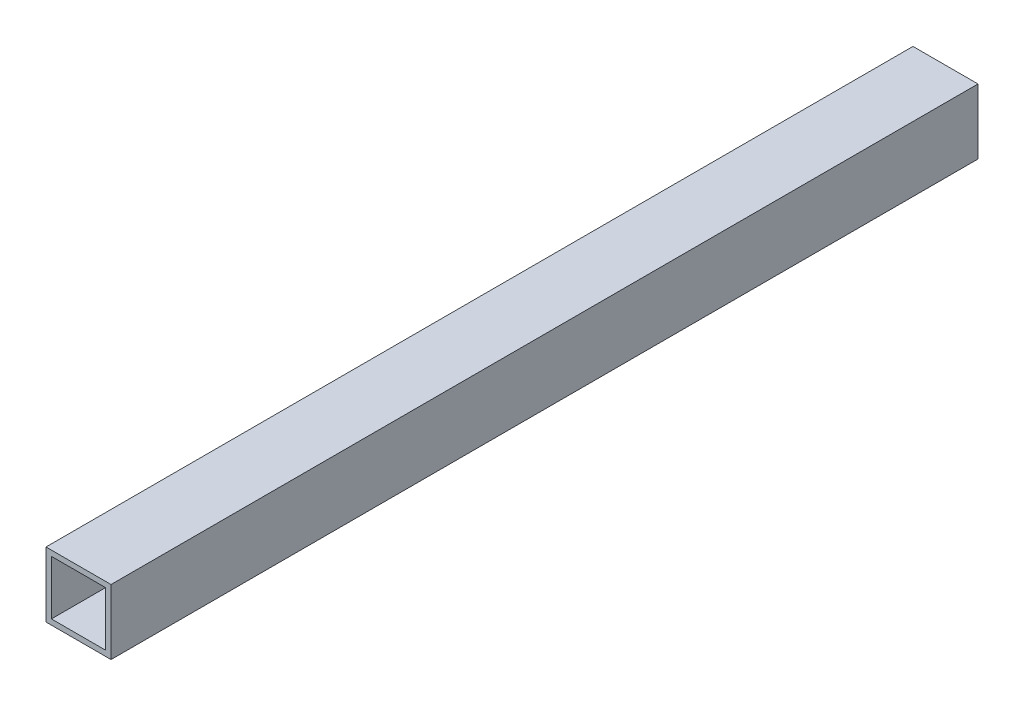
ISO-10303-21;
HEADER;
FILE_DESCRIPTION(('STEP AP214'),'2;1');
FILE_NAME('part.step','',(''),(''),'','','');
FILE_SCHEMA(('AUTOMOTIVE_DESIGN { 1 0 10303 214 1 1 1 1 }'));
ENDSEC;
DATA;
#1=APPLICATION_CONTEXT('core data for automotive mechanical design processes');
#2=APPLICATION_PROTOCOL_DEFINITION('international standard','automotive_design',2000,#1);
#3=PRODUCT_CONTEXT('',#1,'mechanical');
#4=PRODUCT('Part','Part','',(#3));
#5=PRODUCT_RELATED_PRODUCT_CATEGORY('part','',(#4));
#6=PRODUCT_DEFINITION_FORMATION('','',#4);
#7=PRODUCT_DEFINITION_CONTEXT('part definition',#1,'design');
#8=PRODUCT_DEFINITION('design','',#6,#7);
#9=PRODUCT_DEFINITION_SHAPE('','',#8);
#10=(LENGTH_UNIT() NAMED_UNIT(*) SI_UNIT(.MILLI.,.METRE.));
#11=(NAMED_UNIT(*) PLANE_ANGLE_UNIT() SI_UNIT($,.RADIAN.));
#12=(NAMED_UNIT(*) SI_UNIT($,.STERADIAN.) SOLID_ANGLE_UNIT());
#13=UNCERTAINTY_MEASURE_WITH_UNIT(LENGTH_MEASURE(1.E-05),#10,'distance_accuracy_value','');
#14=(GEOMETRIC_REPRESENTATION_CONTEXT(3) GLOBAL_UNCERTAINTY_ASSIGNED_CONTEXT((#13)) GLOBAL_UNIT_ASSIGNED_CONTEXT((#10,
#11,#12)) REPRESENTATION_CONTEXT('',''));
#15=CARTESIAN_POINT('',(0.,0.,0.));
#16=DIRECTION('',(0.,0.,1.));
#17=DIRECTION('',(1.,0.,0.));
#18=AXIS2_PLACEMENT_3D('',#15,#16,#17);
#19=CARTESIAN_POINT('',(0.,0.,254.));
#20=DIRECTION('',(0.,0.,1.));
#21=DIRECTION('',(1.,0.,0.));
#22=AXIS2_PLACEMENT_3D('',#19,#20,#21);
#23=PLANE('',#22);
#24=DIRECTION('',(0.,-1.,0.));
#25=VECTOR('',#24,1.);
#26=CARTESIAN_POINT('',(-19.05,-19.05,254.));
#27=LINE('',#26,#25);
#28=CARTESIAN_POINT('',(-19.05,19.05,254.));
#29=VERTEX_POINT('',#28);
#30=CARTESIAN_POINT('',(-19.05,-19.05,254.));
#31=VERTEX_POINT('',#30);
#32=EDGE_CURVE('E117',#29,#31,#27,.T.);
#33=ORIENTED_EDGE('',*,*,#32,.T.);
#34=DIRECTION('',(1.,0.,0.));
#35=VECTOR('',#34,1.);
#36=CARTESIAN_POINT('',(19.05,-19.05,254.));
#37=LINE('',#36,#35);
#38=CARTESIAN_POINT('',(19.05,-19.05,254.));
#39=VERTEX_POINT('',#38);
#40=EDGE_CURVE('E176',#31,#39,#37,.T.);
#41=ORIENTED_EDGE('',*,*,#40,.T.);
#42=DIRECTION('',(0.,1.,0.));
#43=VECTOR('',#42,1.);
#44=CARTESIAN_POINT('',(19.05,-19.05,254.));
#45=LINE('',#44,#43);
#46=CARTESIAN_POINT('',(19.05,19.05,254.));
#47=VERTEX_POINT('',#46);
#48=EDGE_CURVE('E179',#39,#47,#45,.T.);
#49=ORIENTED_EDGE('',*,*,#48,.T.);
#50=DIRECTION('',(-1.,0.,0.));
#51=VECTOR('',#50,1.);
#52=CARTESIAN_POINT('',(19.05,19.05,254.));
#53=LINE('',#52,#51);
#54=EDGE_CURVE('E63',#47,#29,#53,.T.);
#55=ORIENTED_EDGE('',*,*,#54,.T.);
#56=EDGE_LOOP('',(#33,#41,#49,#55));
#57=FACE_BOUND('',#56,.T.);
#58=DIRECTION('',(1.,0.,0.));
#59=VECTOR('',#58,1.);
#60=CARTESIAN_POINT('',(15.875,-15.875,254.));
#61=LINE('',#60,#59);
#62=CARTESIAN_POINT('',(-15.875,-15.875,254.));
#63=VERTEX_POINT('',#62);
#64=CARTESIAN_POINT('',(15.875,-15.875,254.));
#65=VERTEX_POINT('',#64);
#66=EDGE_CURVE('E158',#63,#65,#61,.T.);
#67=ORIENTED_EDGE('',*,*,#66,.F.);
#68=DIRECTION('',(0.,-1.,0.));
#69=VECTOR('',#68,1.);
#70=CARTESIAN_POINT('',(-15.875,-15.875,254.));
#71=LINE('',#70,#69);
#72=CARTESIAN_POINT('',(-15.875,15.875,254.));
#73=VERTEX_POINT('',#72);
#74=EDGE_CURVE('E113',#73,#63,#71,.T.);
#75=ORIENTED_EDGE('',*,*,#74,.F.);
#76=DIRECTION('',(-1.,0.,0.));
#77=VECTOR('',#76,1.);
#78=CARTESIAN_POINT('',(15.875,15.875,254.));
#79=LINE('',#78,#77);
#80=CARTESIAN_POINT('',(15.875,15.875,254.));
#81=VERTEX_POINT('',#80);
#82=EDGE_CURVE('E164',#81,#73,#79,.T.);
#83=ORIENTED_EDGE('',*,*,#82,.F.);
#84=DIRECTION('',(0.,1.,0.));
#85=VECTOR('',#84,1.);
#86=CARTESIAN_POINT('',(15.875,-15.875,254.));
#87=LINE('',#86,#85);
#88=EDGE_CURVE('E161',#65,#81,#87,.T.);
#89=ORIENTED_EDGE('',*,*,#88,.F.);
#90=EDGE_LOOP('',(#67,#75,#83,#89));
#91=FACE_BOUND('',#90,.T.);
#92=ADVANCED_FACE('F39',(#57,#91),#23,.T.);
#93=CARTESIAN_POINT('',(-19.05,-19.05,254.));
#94=DIRECTION('',(1.,0.,0.));
#95=DIRECTION('',(0.,0.,-1.));
#96=AXIS2_PLACEMENT_3D('',#93,#94,#95);
#97=PLANE('',#96);
#98=DIRECTION('',(0.,0.,-1.));
#99=VECTOR('',#98,1.);
#100=CARTESIAN_POINT('',(-19.05,19.05,254.));
#101=LINE('',#100,#99);
#102=CARTESIAN_POINT('',(-19.05,19.05,-254.));
#103=VERTEX_POINT('',#102);
#104=EDGE_CURVE('E184',#29,#103,#101,.T.);
#105=ORIENTED_EDGE('',*,*,#104,.T.);
#106=DIRECTION('',(0.,-1.,0.));
#107=VECTOR('',#106,1.);
#108=CARTESIAN_POINT('',(-19.05,-19.05,-254.));
#109=LINE('',#108,#107);
#110=CARTESIAN_POINT('',(-19.05,-19.05,-254.));
#111=VERTEX_POINT('',#110);
#112=EDGE_CURVE('E140',#103,#111,#109,.T.);
#113=ORIENTED_EDGE('',*,*,#112,.T.);
#114=DIRECTION('',(0.,0.,-1.));
#115=VECTOR('',#114,1.);
#116=CARTESIAN_POINT('',(-19.05,-19.05,254.));
#117=LINE('',#116,#115);
#118=EDGE_CURVE('E11',#31,#111,#117,.T.);
#119=ORIENTED_EDGE('',*,*,#118,.F.);
#120=ORIENTED_EDGE('',*,*,#32,.F.);
#121=EDGE_LOOP('',(#105,#113,#119,#120));
#122=FACE_BOUND('',#121,.T.);
#123=ADVANCED_FACE('F41',(#122),#97,.F.);
#124=CARTESIAN_POINT('',(19.05,-19.05,254.));
#125=DIRECTION('',(0.,1.,0.));
#126=DIRECTION('',(0.,0.,1.));
#127=AXIS2_PLACEMENT_3D('',#124,#125,#126);
#128=PLANE('',#127);
#129=ORIENTED_EDGE('',*,*,#118,.T.);
#130=DIRECTION('',(1.,0.,0.));
#131=VECTOR('',#130,1.);
#132=CARTESIAN_POINT('',(19.05,-19.05,-254.));
#133=LINE('',#132,#131);
#134=CARTESIAN_POINT('',(19.05,-19.05,-254.));
#135=VERTEX_POINT('',#134);
#136=EDGE_CURVE('E144',#111,#135,#133,.T.);
#137=ORIENTED_EDGE('',*,*,#136,.T.);
#138=DIRECTION('',(0.,0.,-1.));
#139=VECTOR('',#138,1.);
#140=CARTESIAN_POINT('',(19.05,-19.05,254.));
#141=LINE('',#140,#139);
#142=EDGE_CURVE('E48',#39,#135,#141,.T.);
#143=ORIENTED_EDGE('',*,*,#142,.F.);
#144=ORIENTED_EDGE('',*,*,#40,.F.);
#145=EDGE_LOOP('',(#129,#137,#143,#144));
#146=FACE_BOUND('',#145,.T.);
#147=ADVANCED_FACE('F200',(#146),#128,.F.);
#148=CARTESIAN_POINT('',(19.05,-19.05,254.));
#149=DIRECTION('',(-1.,0.,0.));
#150=DIRECTION('',(0.,0.,1.));
#151=AXIS2_PLACEMENT_3D('',#148,#149,#150);
#152=PLANE('',#151);
#153=ORIENTED_EDGE('',*,*,#142,.T.);
#154=DIRECTION('',(0.,1.,0.));
#155=VECTOR('',#154,1.);
#156=CARTESIAN_POINT('',(19.05,-19.05,-254.));
#157=LINE('',#156,#155);
#158=CARTESIAN_POINT('',(19.05,19.05,-254.));
#159=VERTEX_POINT('',#158);
#160=EDGE_CURVE('E148',#135,#159,#157,.T.);
#161=ORIENTED_EDGE('',*,*,#160,.T.);
#162=DIRECTION('',(0.,0.,-1.));
#163=VECTOR('',#162,1.);
#164=CARTESIAN_POINT('',(19.05,19.05,254.));
#165=LINE('',#164,#163);
#166=EDGE_CURVE('E187',#47,#159,#165,.T.);
#167=ORIENTED_EDGE('',*,*,#166,.F.);
#168=ORIENTED_EDGE('',*,*,#48,.F.);
#169=EDGE_LOOP('',(#153,#161,#167,#168));
#170=FACE_BOUND('',#169,.T.);
#171=ADVANCED_FACE('F194',(#170),#152,.F.);
#172=CARTESIAN_POINT('',(19.05,19.05,254.));
#173=DIRECTION('',(0.,-1.,0.));
#174=DIRECTION('',(0.,0.,-1.));
#175=AXIS2_PLACEMENT_3D('',#172,#173,#174);
#176=PLANE('',#175);
#177=ORIENTED_EDGE('',*,*,#166,.T.);
#178=DIRECTION('',(-1.,0.,0.));
#179=VECTOR('',#178,1.);
#180=CARTESIAN_POINT('',(19.05,19.05,-254.));
#181=LINE('',#180,#179);
#182=EDGE_CURVE('E152',#159,#103,#181,.T.);
#183=ORIENTED_EDGE('',*,*,#182,.T.);
#184=ORIENTED_EDGE('',*,*,#104,.F.);
#185=ORIENTED_EDGE('',*,*,#54,.F.);
#186=EDGE_LOOP('',(#177,#183,#184,#185));
#187=FACE_BOUND('',#186,.T.);
#188=ADVANCED_FACE('F205',(#187),#176,.F.);
#189=CARTESIAN_POINT('',(-15.875,-15.875,254.));
#190=DIRECTION('',(1.,0.,0.));
#191=DIRECTION('',(0.,1.,0.));
#192=AXIS2_PLACEMENT_3D('',#189,#190,#191);
#193=PLANE('',#192);
#194=DIRECTION('',(0.,0.,-1.));
#195=VECTOR('',#194,1.);
#196=CARTESIAN_POINT('',(-15.875,-15.875,254.));
#197=LINE('',#196,#195);
#198=CARTESIAN_POINT('',(-15.875,-15.875,-254.));
#199=VERTEX_POINT('',#198);
#200=EDGE_CURVE('E105',#63,#199,#197,.T.);
#201=ORIENTED_EDGE('',*,*,#200,.T.);
#202=DIRECTION('',(0.,-1.,0.));
#203=VECTOR('',#202,1.);
#204=CARTESIAN_POINT('',(-15.875,-15.875,-254.));
#205=LINE('',#204,#203);
#206=CARTESIAN_POINT('',(-15.875,15.875,-254.));
#207=VERTEX_POINT('',#206);
#208=EDGE_CURVE('E110',#207,#199,#205,.T.);
#209=ORIENTED_EDGE('',*,*,#208,.F.);
#210=DIRECTION('',(0.,0.,-1.));
#211=VECTOR('',#210,1.);
#212=CARTESIAN_POINT('',(-15.875,15.875,254.));
#213=LINE('',#212,#211);
#214=EDGE_CURVE('E167',#73,#207,#213,.T.);
#215=ORIENTED_EDGE('',*,*,#214,.F.);
#216=ORIENTED_EDGE('',*,*,#74,.T.);
#217=EDGE_LOOP('',(#201,#209,#215,#216));
#218=FACE_BOUND('',#217,.T.);
#219=ADVANCED_FACE('F107',(#218),#193,.T.);
#220=CARTESIAN_POINT('',(15.875,-15.875,254.));
#221=DIRECTION('',(0.,1.,0.));
#222=DIRECTION('',(0.,0.,1.));
#223=AXIS2_PLACEMENT_3D('',#220,#221,#222);
#224=PLANE('',#223);
#225=DIRECTION('',(0.,0.,-1.));
#226=VECTOR('',#225,1.);
#227=CARTESIAN_POINT('',(15.875,-15.875,254.));
#228=LINE('',#227,#226);
#229=CARTESIAN_POINT('',(15.875,-15.875,-254.));
#230=VERTEX_POINT('',#229);
#231=EDGE_CURVE('E118',#65,#230,#228,.T.);
#232=ORIENTED_EDGE('',*,*,#231,.T.);
#233=DIRECTION('',(1.,0.,0.));
#234=VECTOR('',#233,1.);
#235=CARTESIAN_POINT('',(15.875,-15.875,-254.));
#236=LINE('',#235,#234);
#237=EDGE_CURVE('E121',#199,#230,#236,.T.);
#238=ORIENTED_EDGE('',*,*,#237,.F.);
#239=ORIENTED_EDGE('',*,*,#200,.F.);
#240=ORIENTED_EDGE('',*,*,#66,.T.);
#241=EDGE_LOOP('',(#232,#238,#239,#240));
#242=FACE_BOUND('',#241,.T.);
#243=ADVANCED_FACE('F122',(#242),#224,.T.);
#244=CARTESIAN_POINT('',(15.875,-15.875,254.));
#245=DIRECTION('',(-1.,0.,0.));
#246=DIRECTION('',(0.,0.,1.));
#247=AXIS2_PLACEMENT_3D('',#244,#245,#246);
#248=PLANE('',#247);
#249=DIRECTION('',(0.,0.,-1.));
#250=VECTOR('',#249,1.);
#251=CARTESIAN_POINT('',(15.875,15.875,254.));
#252=LINE('',#251,#250);
#253=CARTESIAN_POINT('',(15.875,15.875,-254.));
#254=VERTEX_POINT('',#253);
#255=EDGE_CURVE('E55',#81,#254,#252,.T.);
#256=ORIENTED_EDGE('',*,*,#255,.T.);
#257=DIRECTION('',(0.,1.,0.));
#258=VECTOR('',#257,1.);
#259=CARTESIAN_POINT('',(15.875,-15.875,-254.));
#260=LINE('',#259,#258);
#261=EDGE_CURVE('E128',#230,#254,#260,.T.);
#262=ORIENTED_EDGE('',*,*,#261,.F.);
#263=ORIENTED_EDGE('',*,*,#231,.F.);
#264=ORIENTED_EDGE('',*,*,#88,.T.);
#265=EDGE_LOOP('',(#256,#262,#263,#264));
#266=FACE_BOUND('',#265,.T.);
#267=ADVANCED_FACE('F223',(#266),#248,.T.);
#268=CARTESIAN_POINT('',(15.875,15.875,254.));
#269=DIRECTION('',(0.,-1.,0.));
#270=DIRECTION('',(0.,0.,-1.));
#271=AXIS2_PLACEMENT_3D('',#268,#269,#270);
#272=PLANE('',#271);
#273=ORIENTED_EDGE('',*,*,#214,.T.);
#274=DIRECTION('',(-1.,0.,0.));
#275=VECTOR('',#274,1.);
#276=CARTESIAN_POINT('',(15.875,15.875,-254.));
#277=LINE('',#276,#275);
#278=EDGE_CURVE('E132',#254,#207,#277,.T.);
#279=ORIENTED_EDGE('',*,*,#278,.F.);
#280=ORIENTED_EDGE('',*,*,#255,.F.);
#281=ORIENTED_EDGE('',*,*,#82,.T.);
#282=EDGE_LOOP('',(#273,#279,#280,#281));
#283=FACE_BOUND('',#282,.T.);
#284=ADVANCED_FACE('F226',(#283),#272,.T.);
#285=CARTESIAN_POINT('',(0.,0.,-254.));
#286=DIRECTION('',(0.,0.,1.));
#287=DIRECTION('',(1.,0.,0.));
#288=AXIS2_PLACEMENT_3D('',#285,#286,#287);
#289=PLANE('',#288);
#290=ORIENTED_EDGE('',*,*,#278,.T.);
#291=ORIENTED_EDGE('',*,*,#208,.T.);
#292=ORIENTED_EDGE('',*,*,#237,.T.);
#293=ORIENTED_EDGE('',*,*,#261,.T.);
#294=EDGE_LOOP('',(#290,#291,#292,#293));
#295=FACE_BOUND('',#294,.T.);
#296=ORIENTED_EDGE('',*,*,#112,.F.);
#297=ORIENTED_EDGE('',*,*,#182,.F.);
#298=ORIENTED_EDGE('',*,*,#160,.F.);
#299=ORIENTED_EDGE('',*,*,#136,.F.);
#300=EDGE_LOOP('',(#296,#297,#298,#299));
#301=FACE_BOUND('',#300,.T.);
#302=ADVANCED_FACE('F130',(#295,#301),#289,.F.);
#303=CLOSED_SHELL('',(#92,#123,#147,#171,#188,#219,#243,#267,#284,#302));
#304=MANIFOLD_SOLID_BREP('B2',#303);
#305=ADVANCED_BREP_SHAPE_REPRESENTATION('',(#18,#304),#14);
#306=SHAPE_DEFINITION_REPRESENTATION(#9,#305);
ENDSEC;
END-ISO-10303-21;
